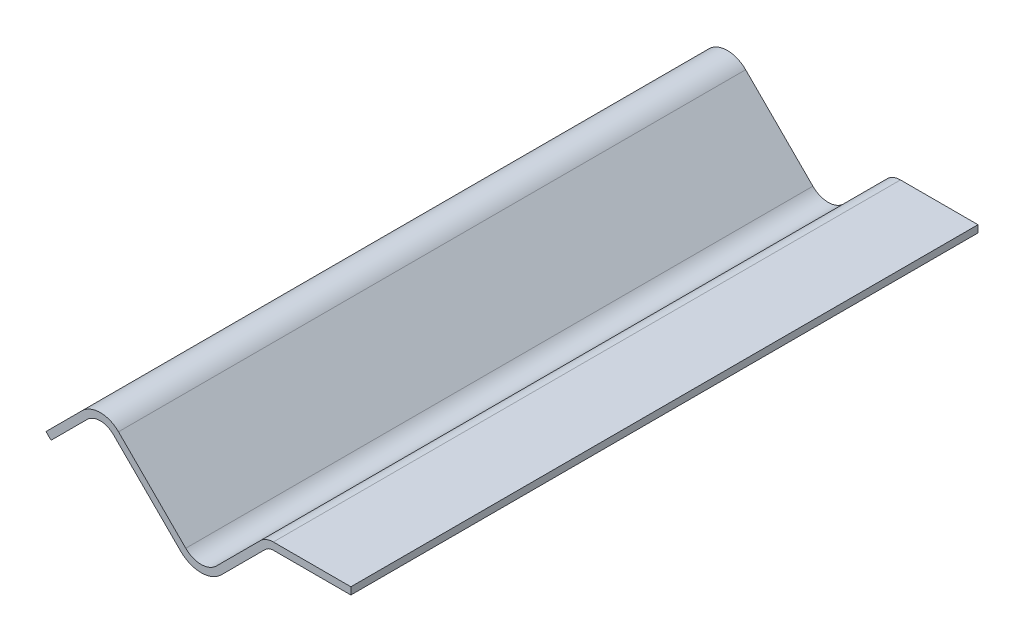
ISO-10303-21;
HEADER;
FILE_DESCRIPTION(('STEP AP214'),'2;1');
FILE_NAME('part.step','',(''),(''),'','','');
FILE_SCHEMA(('AUTOMOTIVE_DESIGN { 1 0 10303 214 1 1 1 1 }'));
ENDSEC;
DATA;
#1=APPLICATION_CONTEXT('core data for automotive mechanical design processes');
#2=APPLICATION_PROTOCOL_DEFINITION('international standard','automotive_design',2000,#1);
#3=PRODUCT_CONTEXT('',#1,'mechanical');
#4=PRODUCT('Part','Part','',(#3));
#5=PRODUCT_RELATED_PRODUCT_CATEGORY('part','',(#4));
#6=PRODUCT_DEFINITION_FORMATION('','',#4);
#7=PRODUCT_DEFINITION_CONTEXT('part definition',#1,'design');
#8=PRODUCT_DEFINITION('design','',#6,#7);
#9=PRODUCT_DEFINITION_SHAPE('','',#8);
#10=(LENGTH_UNIT() NAMED_UNIT(*) SI_UNIT(.MILLI.,.METRE.));
#11=(NAMED_UNIT(*) PLANE_ANGLE_UNIT() SI_UNIT($,.RADIAN.));
#12=(NAMED_UNIT(*) SI_UNIT($,.STERADIAN.) SOLID_ANGLE_UNIT());
#13=UNCERTAINTY_MEASURE_WITH_UNIT(LENGTH_MEASURE(1.E-05),#10,'distance_accuracy_value','');
#14=(GEOMETRIC_REPRESENTATION_CONTEXT(3) GLOBAL_UNCERTAINTY_ASSIGNED_CONTEXT((#13)) GLOBAL_UNIT_ASSIGNED_CONTEXT((#10,
#11,#12)) REPRESENTATION_CONTEXT('',''));
#15=CARTESIAN_POINT('',(0.,0.,0.));
#16=DIRECTION('',(0.,0.,1.));
#17=DIRECTION('',(1.,0.,0.));
#18=AXIS2_PLACEMENT_3D('',#15,#16,#17);
#19=CARTESIAN_POINT('',(2.0521699932434,-2.0521699932434,127.));
#20=DIRECTION('',(0.707106781186547,0.707106781186548,0.));
#21=DIRECTION('',(-0.707106781186548,0.707106781186547,0.));
#22=AXIS2_PLACEMENT_3D('',#19,#20,#21);
#23=PLANE('',#22);
#24=DIRECTION('',(0.707106781186548,-0.707106781186547,0.));
#25=VECTOR('',#24,1.);
#26=CARTESIAN_POINT('',(2.0521699932434,-2.0521699932434,-127.));
#27=LINE('',#26,#25);
#28=CARTESIAN_POINT('',(0.,0.,-127.));
#29=VERTEX_POINT('',#28);
#30=CARTESIAN_POINT('',(2.0521699932434,-2.0521699932434,-127.));
#31=VERTEX_POINT('',#30);
#32=EDGE_CURVE('E188',#29,#31,#27,.T.);
#33=ORIENTED_EDGE('',*,*,#32,.T.);
#34=DIRECTION('',(0.,0.,-1.));
#35=VECTOR('',#34,1.);
#36=CARTESIAN_POINT('',(2.0521699932434,-2.0521699932434,127.));
#37=LINE('',#36,#35);
#38=CARTESIAN_POINT('',(2.0521699932434,-2.0521699932434,127.));
#39=VERTEX_POINT('',#38);
#40=EDGE_CURVE('E11',#39,#31,#37,.T.);
#41=ORIENTED_EDGE('',*,*,#40,.F.);
#42=DIRECTION('',(0.707106781186548,-0.707106781186547,0.));
#43=VECTOR('',#42,1.);
#44=CARTESIAN_POINT('',(2.0521699932434,-2.0521699932434,127.));
#45=LINE('',#44,#43);
#46=CARTESIAN_POINT('',(0.,0.,127.));
#47=VERTEX_POINT('',#46);
#48=EDGE_CURVE('E234',#47,#39,#45,.T.);
#49=ORIENTED_EDGE('',*,*,#48,.F.);
#50=DIRECTION('',(0.,0.,-1.));
#51=VECTOR('',#50,1.);
#52=CARTESIAN_POINT('',(0.,0.,127.));
#53=LINE('',#52,#51);
#54=EDGE_CURVE('E184',#47,#29,#53,.T.);
#55=ORIENTED_EDGE('',*,*,#54,.T.);
#56=EDGE_LOOP('',(#33,#41,#49,#55));
#57=FACE_BOUND('',#56,.T.);
#58=ADVANCED_FACE('F39',(#57),#23,.F.);
#59=CARTESIAN_POINT('',(16.6399408158057,12.5356008293189,127.));
#60=DIRECTION('',(-0.707106781186547,0.707106781186548,0.));
#61=DIRECTION('',(-0.707106781186548,-0.707106781186547,0.));
#62=AXIS2_PLACEMENT_3D('',#59,#60,#61);
#63=PLANE('',#62);
#64=DIRECTION('',(0.707106781186548,0.707106781186547,0.));
#65=VECTOR('',#64,1.);
#66=CARTESIAN_POINT('',(16.6399408158057,12.5356008293189,-127.));
#67=LINE('',#66,#65);
#68=CARTESIAN_POINT('',(16.6399408158057,12.5356008293189,-127.));
#69=VERTEX_POINT('',#68);
#70=EDGE_CURVE('E192',#31,#69,#67,.T.);
#71=ORIENTED_EDGE('',*,*,#70,.T.);
#72=DIRECTION('',(0.,0.,-1.));
#73=VECTOR('',#72,1.);
#74=CARTESIAN_POINT('',(16.6399408158057,12.5356008293189,127.));
#75=LINE('',#74,#73);
#76=CARTESIAN_POINT('',(16.6399408158057,12.5356008293189,127.));
#77=VERTEX_POINT('',#76);
#78=EDGE_CURVE('E48',#77,#69,#75,.T.);
#79=ORIENTED_EDGE('',*,*,#78,.F.);
#80=DIRECTION('',(0.707106781186548,0.707106781186547,0.));
#81=VECTOR('',#80,1.);
#82=CARTESIAN_POINT('',(16.6399408158057,12.5356008293189,127.));
#83=LINE('',#82,#81);
#84=EDGE_CURVE('E123',#39,#77,#83,.T.);
#85=ORIENTED_EDGE('',*,*,#84,.F.);
#86=ORIENTED_EDGE('',*,*,#40,.T.);
#87=EDGE_LOOP('',(#71,#79,#85,#86));
#88=FACE_BOUND('',#87,.T.);
#89=ADVANCED_FACE('F356',(#88),#63,.F.);
#90=CARTESIAN_POINT('',(21.9791222168929,7.19641942823163,127.));
#91=DIRECTION('',(0.,0.,-1.));
#92=DIRECTION('',(-1.,0.,0.));
#93=AXIS2_PLACEMENT_3D('',#90,#91,#92);
#94=CYLINDRICAL_SURFACE('',#93,7.55074274938774);
#95=CARTESIAN_POINT('',(21.9791222168929,7.19641942823163,-127.));
#96=DIRECTION('',(0.,0.,-1.));
#97=DIRECTION('',(1.,0.,0.));
#98=AXIS2_PLACEMENT_3D('',#95,#96,#97);
#99=CIRCLE('',#98,7.55074274938774);
#100=CARTESIAN_POINT('',(27.3183036179801,12.5356008293189,-127.));
#101=VERTEX_POINT('',#100);
#102=EDGE_CURVE('E195',#69,#101,#99,.T.);
#103=ORIENTED_EDGE('',*,*,#102,.T.);
#104=DIRECTION('',(0.,0.,-1.));
#105=VECTOR('',#104,1.);
#106=CARTESIAN_POINT('',(27.3183036179801,12.5356008293189,127.));
#107=LINE('',#106,#105);
#108=CARTESIAN_POINT('',(27.3183036179801,12.5356008293189,127.));
#109=VERTEX_POINT('',#108);
#110=EDGE_CURVE('E277',#109,#101,#107,.T.);
#111=ORIENTED_EDGE('',*,*,#110,.F.);
#112=CARTESIAN_POINT('',(21.9791222168929,7.19641942823163,127.));
#113=DIRECTION('',(0.,0.,-1.));
#114=DIRECTION('',(1.,0.,0.));
#115=AXIS2_PLACEMENT_3D('',#112,#113,#114);
#116=CIRCLE('',#115,7.55074274938774);
#117=EDGE_CURVE('E287',#77,#109,#116,.T.);
#118=ORIENTED_EDGE('',*,*,#117,.F.);
#119=ORIENTED_EDGE('',*,*,#78,.T.);
#120=EDGE_LOOP('',(#103,#111,#118,#119));
#121=FACE_BOUND('',#120,.T.);
#122=ADVANCED_FACE('F285',(#121),#94,.F.);
#123=CARTESIAN_POINT('',(54.5533431349518,-14.6994386876528,127.));
#124=DIRECTION('',(0.707106781186547,0.707106781186548,0.));
#125=DIRECTION('',(-0.707106781186548,0.707106781186547,0.));
#126=AXIS2_PLACEMENT_3D('',#123,#124,#125);
#127=PLANE('',#126);
#128=DIRECTION('',(0.707106781186548,-0.707106781186547,0.));
#129=VECTOR('',#128,1.);
#130=CARTESIAN_POINT('',(54.5533431349518,-14.6994386876528,-127.));
#131=LINE('',#130,#129);
#132=CARTESIAN_POINT('',(54.5533431349518,-14.6994386876528,-127.));
#133=VERTEX_POINT('',#132);
#134=EDGE_CURVE('E198',#101,#133,#131,.T.);
#135=ORIENTED_EDGE('',*,*,#134,.T.);
#136=DIRECTION('',(0.,0.,-1.));
#137=VECTOR('',#136,1.);
#138=CARTESIAN_POINT('',(54.5533431349518,-14.6994386876528,127.));
#139=LINE('',#138,#137);
#140=CARTESIAN_POINT('',(54.5533431349518,-14.6994386876528,127.));
#141=VERTEX_POINT('',#140);
#142=EDGE_CURVE('E273',#141,#133,#139,.T.);
#143=ORIENTED_EDGE('',*,*,#142,.F.);
#144=DIRECTION('',(0.707106781186548,-0.707106781186547,0.));
#145=VECTOR('',#144,1.);
#146=CARTESIAN_POINT('',(54.5533431349518,-14.6994386876528,127.));
#147=LINE('',#146,#145);
#148=EDGE_CURVE('E306',#109,#141,#147,.T.);
#149=ORIENTED_EDGE('',*,*,#148,.F.);
#150=ORIENTED_EDGE('',*,*,#110,.T.);
#151=EDGE_LOOP('',(#135,#143,#149,#150));
#152=FACE_BOUND('',#151,.T.);
#153=ADVANCED_FACE('F296',(#152),#127,.F.);
#154=CARTESIAN_POINT('',(62.8183402356592,-6.43444158694546,127.));
#155=DIRECTION('',(0.,0.,-1.));
#156=DIRECTION('',(-1.,0.,0.));
#157=AXIS2_PLACEMENT_3D('',#154,#155,#156);
#158=CYLINDRICAL_SURFACE('',#157,11.6884709927947);
#159=CARTESIAN_POINT('',(62.8183402356592,-6.43444158694546,-127.));
#160=DIRECTION('',(0.,0.,1.));
#161=DIRECTION('',(-1.,0.,0.));
#162=AXIS2_PLACEMENT_3D('',#159,#160,#161);
#163=CIRCLE('',#162,11.6884709927947);
#164=CARTESIAN_POINT('',(71.0833373363666,-14.6994386876528,-127.));
#165=VERTEX_POINT('',#164);
#166=EDGE_CURVE('E201',#133,#165,#163,.T.);
#167=ORIENTED_EDGE('',*,*,#166,.T.);
#168=DIRECTION('',(0.,0.,-1.));
#169=VECTOR('',#168,1.);
#170=CARTESIAN_POINT('',(71.0833373363666,-14.6994386876528,127.));
#171=LINE('',#170,#169);
#172=CARTESIAN_POINT('',(71.0833373363666,-14.6994386876528,127.));
#173=VERTEX_POINT('',#172);
#174=EDGE_CURVE('E269',#173,#165,#171,.T.);
#175=ORIENTED_EDGE('',*,*,#174,.F.);
#176=CARTESIAN_POINT('',(62.8183402356592,-6.43444158694546,127.));
#177=DIRECTION('',(0.,0.,1.));
#178=DIRECTION('',(-1.,0.,0.));
#179=AXIS2_PLACEMENT_3D('',#176,#177,#178);
#180=CIRCLE('',#179,11.6884709927947);
#181=EDGE_CURVE('E302',#141,#173,#180,.T.);
#182=ORIENTED_EDGE('',*,*,#181,.F.);
#183=ORIENTED_EDGE('',*,*,#142,.T.);
#184=EDGE_LOOP('',(#167,#175,#182,#183));
#185=FACE_BOUND('',#184,.T.);
#186=ADVANCED_FACE('F300',(#185),#158,.T.);
#187=CARTESIAN_POINT('',(88.8144036169779,3.03162759295852,127.));
#188=DIRECTION('',(-0.707106781186547,0.707106781186548,0.));
#189=DIRECTION('',(-0.707106781186548,-0.707106781186547,0.));
#190=AXIS2_PLACEMENT_3D('',#187,#188,#189);
#191=PLANE('',#190);
#192=DIRECTION('',(0.707106781186548,0.707106781186547,0.));
#193=VECTOR('',#192,1.);
#194=CARTESIAN_POINT('',(88.8144036169779,3.03162759295852,-127.));
#195=LINE('',#194,#193);
#196=CARTESIAN_POINT('',(88.8144036169779,3.03162759295852,-127.));
#197=VERTEX_POINT('',#196);
#198=EDGE_CURVE('E204',#165,#197,#195,.T.);
#199=ORIENTED_EDGE('',*,*,#198,.T.);
#200=DIRECTION('',(0.,0.,-1.));
#201=VECTOR('',#200,1.);
#202=CARTESIAN_POINT('',(88.8144036169779,3.03162759295852,127.));
#203=LINE('',#202,#201);
#204=CARTESIAN_POINT('',(88.8144036169779,3.03162759295852,127.));
#205=VERTEX_POINT('',#204);
#206=EDGE_CURVE('E265',#205,#197,#203,.T.);
#207=ORIENTED_EDGE('',*,*,#206,.F.);
#208=DIRECTION('',(0.707106781186548,0.707106781186547,0.));
#209=VECTOR('',#208,1.);
#210=CARTESIAN_POINT('',(88.8144036169779,3.03162759295852,127.));
#211=LINE('',#210,#209);
#212=EDGE_CURVE('E305',#173,#205,#211,.T.);
#213=ORIENTED_EDGE('',*,*,#212,.F.);
#214=ORIENTED_EDGE('',*,*,#174,.T.);
#215=EDGE_LOOP('',(#199,#207,#213,#214));
#216=FACE_BOUND('',#215,.T.);
#217=ADVANCED_FACE('F369',(#216),#191,.F.);
#218=CARTESIAN_POINT('',(92.0805276098803,-0.234496399943819,127.));
#219=DIRECTION('',(0.,0.,-1.));
#220=DIRECTION('',(-1.,0.,0.));
#221=AXIS2_PLACEMENT_3D('',#218,#219,#220);
#222=CYLINDRICAL_SURFACE('',#221,4.61899684715465);
#223=CARTESIAN_POINT('',(92.0805276098803,-0.234496399943819,-127.));
#224=DIRECTION('',(0.,0.,-1.));
#225=DIRECTION('',(1.,0.,0.));
#226=AXIS2_PLACEMENT_3D('',#223,#224,#225);
#227=CIRCLE('',#226,4.61899684715465);
#228=CARTESIAN_POINT('',(92.0805276098803,4.38450044721083,-127.));
#229=VERTEX_POINT('',#228);
#230=EDGE_CURVE('E207',#197,#229,#227,.T.);
#231=ORIENTED_EDGE('',*,*,#230,.T.);
#232=DIRECTION('',(0.,0.,-1.));
#233=VECTOR('',#232,1.);
#234=CARTESIAN_POINT('',(92.0805276098803,4.38450044721083,127.));
#235=LINE('',#234,#233);
#236=CARTESIAN_POINT('',(92.0805276098803,4.38450044721083,127.));
#237=VERTEX_POINT('',#236);
#238=EDGE_CURVE('E261',#237,#229,#235,.T.);
#239=ORIENTED_EDGE('',*,*,#238,.F.);
#240=CARTESIAN_POINT('',(92.0805276098803,-0.234496399943819,127.));
#241=DIRECTION('',(0.,0.,-1.));
#242=DIRECTION('',(1.,0.,0.));
#243=AXIS2_PLACEMENT_3D('',#240,#241,#242);
#244=CIRCLE('',#243,4.61899684715465);
#245=EDGE_CURVE('E310',#205,#237,#244,.T.);
#246=ORIENTED_EDGE('',*,*,#245,.F.);
#247=ORIENTED_EDGE('',*,*,#206,.T.);
#248=EDGE_LOOP('',(#231,#239,#246,#247));
#249=FACE_BOUND('',#248,.T.);
#250=ADVANCED_FACE('F372',(#249),#222,.F.);
#251=CARTESIAN_POINT('',(123.484493194483,4.38450044721083,127.));
#252=DIRECTION('',(0.,1.,0.));
#253=DIRECTION('',(0.,0.,1.));
#254=AXIS2_PLACEMENT_3D('',#251,#252,#253);
#255=PLANE('',#254);
#256=DIRECTION('',(1.,0.,0.));
#257=VECTOR('',#256,1.);
#258=CARTESIAN_POINT('',(123.484493194483,4.38450044721083,-127.));
#259=LINE('',#258,#257);
#260=CARTESIAN_POINT('',(123.484493194483,4.38450044721083,-127.));
#261=VERTEX_POINT('',#260);
#262=EDGE_CURVE('E210',#229,#261,#259,.T.);
#263=ORIENTED_EDGE('',*,*,#262,.T.);
#264=DIRECTION('',(0.,0.,-1.));
#265=VECTOR('',#264,1.);
#266=CARTESIAN_POINT('',(123.484493194483,4.38450044721083,127.));
#267=LINE('',#266,#265);
#268=CARTESIAN_POINT('',(123.484493194483,4.38450044721083,127.));
#269=VERTEX_POINT('',#268);
#270=EDGE_CURVE('E257',#269,#261,#267,.T.);
#271=ORIENTED_EDGE('',*,*,#270,.F.);
#272=DIRECTION('',(1.,0.,0.));
#273=VECTOR('',#272,1.);
#274=CARTESIAN_POINT('',(123.484493194483,4.38450044721083,127.));
#275=LINE('',#274,#273);
#276=EDGE_CURVE('E317',#237,#269,#275,.T.);
#277=ORIENTED_EDGE('',*,*,#276,.F.);
#278=ORIENTED_EDGE('',*,*,#238,.T.);
#279=EDGE_LOOP('',(#263,#271,#277,#278));
#280=FACE_BOUND('',#279,.T.);
#281=ADVANCED_FACE('F376',(#280),#255,.F.);
#282=CARTESIAN_POINT('',(123.484493194483,7.28670708395075,127.));
#283=DIRECTION('',(-1.,0.,0.));
#284=DIRECTION('',(0.,0.,1.));
#285=AXIS2_PLACEMENT_3D('',#282,#283,#284);
#286=PLANE('',#285);
#287=DIRECTION('',(0.,1.,0.));
#288=VECTOR('',#287,1.);
#289=CARTESIAN_POINT('',(123.484493194483,7.28670708395075,-127.));
#290=LINE('',#289,#288);
#291=CARTESIAN_POINT('',(123.484493194483,7.28670708395075,-127.));
#292=VERTEX_POINT('',#291);
#293=EDGE_CURVE('E213',#261,#292,#290,.T.);
#294=ORIENTED_EDGE('',*,*,#293,.T.);
#295=DIRECTION('',(0.,0.,-1.));
#296=VECTOR('',#295,1.);
#297=CARTESIAN_POINT('',(123.484493194483,7.28670708395075,127.));
#298=LINE('',#297,#296);
#299=CARTESIAN_POINT('',(123.484493194483,7.28670708395075,127.));
#300=VERTEX_POINT('',#299);
#301=EDGE_CURVE('E253',#300,#292,#298,.T.);
#302=ORIENTED_EDGE('',*,*,#301,.F.);
#303=DIRECTION('',(0.,1.,0.));
#304=VECTOR('',#303,1.);
#305=CARTESIAN_POINT('',(123.484493194483,7.28670708395075,127.));
#306=LINE('',#305,#304);
#307=EDGE_CURVE('E320',#269,#300,#306,.T.);
#308=ORIENTED_EDGE('',*,*,#307,.F.);
#309=ORIENTED_EDGE('',*,*,#270,.T.);
#310=EDGE_LOOP('',(#294,#302,#308,#309));
#311=FACE_BOUND('',#310,.T.);
#312=ADVANCED_FACE('F380',(#311),#286,.F.);
#313=CARTESIAN_POINT('',(92.0805276098803,7.28670708395075,127.));
#314=DIRECTION('',(0.,-1.,0.));
#315=DIRECTION('',(0.,0.,-1.));
#316=AXIS2_PLACEMENT_3D('',#313,#314,#315);
#317=PLANE('',#316);
#318=DIRECTION('',(-1.,0.,0.));
#319=VECTOR('',#318,1.);
#320=CARTESIAN_POINT('',(92.0805276098803,7.28670708395075,-127.));
#321=LINE('',#320,#319);
#322=CARTESIAN_POINT('',(92.0805276098803,7.28670708395074,-127.));
#323=VERTEX_POINT('',#322);
#324=EDGE_CURVE('E216',#292,#323,#321,.T.);
#325=ORIENTED_EDGE('',*,*,#324,.T.);
#326=DIRECTION('',(0.,0.,-1.));
#327=VECTOR('',#326,1.);
#328=CARTESIAN_POINT('',(92.0805276098803,7.28670708395074,127.));
#329=LINE('',#328,#327);
#330=CARTESIAN_POINT('',(92.0805276098803,7.28670708395074,127.));
#331=VERTEX_POINT('',#330);
#332=EDGE_CURVE('E249',#331,#323,#329,.T.);
#333=ORIENTED_EDGE('',*,*,#332,.F.);
#334=DIRECTION('',(-1.,0.,0.));
#335=VECTOR('',#334,1.);
#336=CARTESIAN_POINT('',(92.0805276098803,7.28670708395075,127.));
#337=LINE('',#336,#335);
#338=EDGE_CURVE('E323',#300,#331,#337,.T.);
#339=ORIENTED_EDGE('',*,*,#338,.F.);
#340=ORIENTED_EDGE('',*,*,#301,.T.);
#341=EDGE_LOOP('',(#325,#333,#339,#340));
#342=FACE_BOUND('',#341,.T.);
#343=ADVANCED_FACE('F384',(#342),#317,.F.);
#344=CARTESIAN_POINT('',(92.0805276098803,-0.234496399943819,127.));
#345=DIRECTION('',(0.,0.,-1.));
#346=DIRECTION('',(-1.,0.,0.));
#347=AXIS2_PLACEMENT_3D('',#344,#345,#346);
#348=CYLINDRICAL_SURFACE('',#347,7.52120348389456);
#349=CARTESIAN_POINT('',(92.0805276098803,-0.234496399943819,-127.));
#350=DIRECTION('',(0.,0.,1.));
#351=DIRECTION('',(-1.,0.,0.));
#352=AXIS2_PLACEMENT_3D('',#349,#350,#351);
#353=CIRCLE('',#352,7.52120348389456);
#354=CARTESIAN_POINT('',(86.7622336237346,5.08379758620191,-127.));
#355=VERTEX_POINT('',#354);
#356=EDGE_CURVE('E219',#323,#355,#353,.T.);
#357=ORIENTED_EDGE('',*,*,#356,.T.);
#358=DIRECTION('',(0.,0.,-1.));
#359=VECTOR('',#358,1.);
#360=CARTESIAN_POINT('',(86.7622336237346,5.08379758620191,127.));
#361=LINE('',#360,#359);
#362=CARTESIAN_POINT('',(86.7622336237346,5.08379758620191,127.));
#363=VERTEX_POINT('',#362);
#364=EDGE_CURVE('E245',#363,#355,#361,.T.);
#365=ORIENTED_EDGE('',*,*,#364,.F.);
#366=CARTESIAN_POINT('',(92.0805276098803,-0.234496399943819,127.));
#367=DIRECTION('',(0.,0.,1.));
#368=DIRECTION('',(-1.,0.,0.));
#369=AXIS2_PLACEMENT_3D('',#366,#367,#368);
#370=CIRCLE('',#369,7.52120348389456);
#371=EDGE_CURVE('E326',#331,#363,#370,.T.);
#372=ORIENTED_EDGE('',*,*,#371,.F.);
#373=ORIENTED_EDGE('',*,*,#332,.T.);
#374=EDGE_LOOP('',(#357,#365,#372,#373));
#375=FACE_BOUND('',#374,.T.);
#376=ADVANCED_FACE('F388',(#375),#348,.T.);
#377=CARTESIAN_POINT('',(69.0311673431232,-12.6472686944094,127.));
#378=DIRECTION('',(0.707106781186547,-0.707106781186548,0.));
#379=DIRECTION('',(0.707106781186548,0.707106781186547,0.));
#380=AXIS2_PLACEMENT_3D('',#377,#378,#379);
#381=PLANE('',#380);
#382=DIRECTION('',(-0.707106781186548,-0.707106781186547,0.));
#383=VECTOR('',#382,1.);
#384=CARTESIAN_POINT('',(69.0311673431232,-12.6472686944094,-127.));
#385=LINE('',#384,#383);
#386=CARTESIAN_POINT('',(69.0311673431232,-12.6472686944094,-127.));
#387=VERTEX_POINT('',#386);
#388=EDGE_CURVE('E222',#355,#387,#385,.T.);
#389=ORIENTED_EDGE('',*,*,#388,.T.);
#390=DIRECTION('',(0.,0.,-1.));
#391=VECTOR('',#390,1.);
#392=CARTESIAN_POINT('',(69.0311673431232,-12.6472686944094,127.));
#393=LINE('',#392,#391);
#394=CARTESIAN_POINT('',(69.0311673431232,-12.6472686944094,127.));
#395=VERTEX_POINT('',#394);
#396=EDGE_CURVE('E241',#395,#387,#393,.T.);
#397=ORIENTED_EDGE('',*,*,#396,.F.);
#398=DIRECTION('',(-0.707106781186548,-0.707106781186547,0.));
#399=VECTOR('',#398,1.);
#400=CARTESIAN_POINT('',(69.0311673431232,-12.6472686944094,127.));
#401=LINE('',#400,#399);
#402=EDGE_CURVE('E329',#363,#395,#401,.T.);
#403=ORIENTED_EDGE('',*,*,#402,.F.);
#404=ORIENTED_EDGE('',*,*,#364,.T.);
#405=EDGE_LOOP('',(#389,#397,#403,#404));
#406=FACE_BOUND('',#405,.T.);
#407=ADVANCED_FACE('F337',(#406),#381,.F.);
#408=CARTESIAN_POINT('',(62.8183402356592,-6.43444158694546,127.));
#409=DIRECTION('',(0.,0.,-1.));
#410=DIRECTION('',(-1.,0.,0.));
#411=AXIS2_PLACEMENT_3D('',#408,#409,#410);
#412=CYLINDRICAL_SURFACE('',#411,8.78626435605477);
#413=CARTESIAN_POINT('',(62.8183402356592,-6.43444158694546,-127.));
#414=DIRECTION('',(0.,0.,-1.));
#415=DIRECTION('',(1.,0.,0.));
#416=AXIS2_PLACEMENT_3D('',#413,#414,#415);
#417=CIRCLE('',#416,8.78626435605477);
#418=CARTESIAN_POINT('',(56.6055131281952,-12.6472686944094,-127.));
#419=VERTEX_POINT('',#418);
#420=EDGE_CURVE('E225',#387,#419,#417,.T.);
#421=ORIENTED_EDGE('',*,*,#420,.T.);
#422=DIRECTION('',(0.,0.,-1.));
#423=VECTOR('',#422,1.);
#424=CARTESIAN_POINT('',(56.6055131281952,-12.6472686944094,127.));
#425=LINE('',#424,#423);
#426=CARTESIAN_POINT('',(56.6055131281952,-12.6472686944094,127.));
#427=VERTEX_POINT('',#426);
#428=EDGE_CURVE('E177',#427,#419,#425,.T.);
#429=ORIENTED_EDGE('',*,*,#428,.F.);
#430=CARTESIAN_POINT('',(62.8183402356592,-6.43444158694546,127.));
#431=DIRECTION('',(0.,0.,-1.));
#432=DIRECTION('',(1.,0.,0.));
#433=AXIS2_PLACEMENT_3D('',#430,#431,#432);
#434=CIRCLE('',#433,8.78626435605477);
#435=EDGE_CURVE('E166',#395,#427,#434,.T.);
#436=ORIENTED_EDGE('',*,*,#435,.F.);
#437=ORIENTED_EDGE('',*,*,#396,.T.);
#438=EDGE_LOOP('',(#421,#429,#436,#437));
#439=FACE_BOUND('',#438,.T.);
#440=ADVANCED_FACE('F341',(#439),#412,.F.);
#441=CARTESIAN_POINT('',(29.3704736112235,14.5877708225623,127.));
#442=DIRECTION('',(-0.707106781186548,-0.707106781186548,0.));
#443=DIRECTION('',(0.707106781186548,-0.707106781186548,0.));
#444=AXIS2_PLACEMENT_3D('',#441,#442,#443);
#445=PLANE('',#444);
#446=DIRECTION('',(-0.707106781186548,0.707106781186548,0.));
#447=VECTOR('',#446,1.);
#448=CARTESIAN_POINT('',(29.3704736112235,14.5877708225623,-127.));
#449=LINE('',#448,#447);
#450=CARTESIAN_POINT('',(29.3704736112235,14.5877708225623,-127.));
#451=VERTEX_POINT('',#450);
#452=EDGE_CURVE('E175',#419,#451,#449,.T.);
#453=ORIENTED_EDGE('',*,*,#452,.T.);
#454=DIRECTION('',(0.,0.,-1.));
#455=VECTOR('',#454,1.);
#456=CARTESIAN_POINT('',(29.3704736112235,14.5877708225623,127.));
#457=LINE('',#456,#455);
#458=CARTESIAN_POINT('',(29.3704736112235,14.5877708225623,127.));
#459=VERTEX_POINT('',#458);
#460=EDGE_CURVE('E172',#459,#451,#457,.T.);
#461=ORIENTED_EDGE('',*,*,#460,.F.);
#462=DIRECTION('',(-0.707106781186548,0.707106781186548,0.));
#463=VECTOR('',#462,1.);
#464=CARTESIAN_POINT('',(29.3704736112235,14.5877708225623,127.));
#465=LINE('',#464,#463);
#466=EDGE_CURVE('E160',#427,#459,#465,.T.);
#467=ORIENTED_EDGE('',*,*,#466,.F.);
#468=ORIENTED_EDGE('',*,*,#428,.T.);
#469=EDGE_LOOP('',(#453,#461,#467,#468));
#470=FACE_BOUND('',#469,.T.);
#471=ADVANCED_FACE('F173',(#470),#445,.F.);
#472=CARTESIAN_POINT('',(21.9791222168929,7.19641942823163,127.));
#473=DIRECTION('',(0.,0.,-1.));
#474=DIRECTION('',(-1.,0.,0.));
#475=AXIS2_PLACEMENT_3D('',#472,#473,#474);
#476=CYLINDRICAL_SURFACE('',#475,10.4529493861277);
#477=CARTESIAN_POINT('',(21.9791222168929,7.19641942823163,-127.));
#478=DIRECTION('',(0.,0.,1.));
#479=DIRECTION('',(-1.,0.,0.));
#480=AXIS2_PLACEMENT_3D('',#477,#478,#479);
#481=CIRCLE('',#480,10.4529493861277);
#482=CARTESIAN_POINT('',(14.5877708225623,14.5877708225623,-127.));
#483=VERTEX_POINT('',#482);
#484=EDGE_CURVE('E109',#451,#483,#481,.T.);
#485=ORIENTED_EDGE('',*,*,#484,.T.);
#486=DIRECTION('',(0.,0.,-1.));
#487=VECTOR('',#486,1.);
#488=CARTESIAN_POINT('',(14.5877708225623,14.5877708225623,127.));
#489=LINE('',#488,#487);
#490=CARTESIAN_POINT('',(14.5877708225623,14.5877708225623,127.));
#491=VERTEX_POINT('',#490);
#492=EDGE_CURVE('E178',#491,#483,#489,.T.);
#493=ORIENTED_EDGE('',*,*,#492,.F.);
#494=CARTESIAN_POINT('',(21.9791222168929,7.19641942823163,127.));
#495=DIRECTION('',(0.,0.,1.));
#496=DIRECTION('',(-1.,0.,0.));
#497=AXIS2_PLACEMENT_3D('',#494,#495,#496);
#498=CIRCLE('',#497,10.4529493861277);
#499=EDGE_CURVE('E164',#459,#491,#498,.T.);
#500=ORIENTED_EDGE('',*,*,#499,.F.);
#501=ORIENTED_EDGE('',*,*,#460,.T.);
#502=EDGE_LOOP('',(#485,#493,#500,#501));
#503=FACE_BOUND('',#502,.T.);
#504=ADVANCED_FACE('F180',(#503),#476,.T.);
#505=CARTESIAN_POINT('',(0.,0.,127.));
#506=DIRECTION('',(0.707106781186547,-0.707106781186548,0.));
#507=DIRECTION('',(0.707106781186548,0.707106781186547,0.));
#508=AXIS2_PLACEMENT_3D('',#505,#506,#507);
#509=PLANE('',#508);
#510=DIRECTION('',(-0.707106781186548,-0.707106781186547,0.));
#511=VECTOR('',#510,1.);
#512=CARTESIAN_POINT('',(0.,0.,-127.));
#513=LINE('',#512,#511);
#514=EDGE_CURVE('E115',#483,#29,#513,.T.);
#515=ORIENTED_EDGE('',*,*,#514,.T.);
#516=ORIENTED_EDGE('',*,*,#54,.F.);
#517=DIRECTION('',(-0.707106781186548,-0.707106781186547,0.));
#518=VECTOR('',#517,1.);
#519=CARTESIAN_POINT('',(0.,0.,127.));
#520=LINE('',#519,#518);
#521=EDGE_CURVE('E56',#491,#47,#520,.T.);
#522=ORIENTED_EDGE('',*,*,#521,.F.);
#523=ORIENTED_EDGE('',*,*,#492,.T.);
#524=EDGE_LOOP('',(#515,#516,#522,#523));
#525=FACE_BOUND('',#524,.T.);
#526=ADVANCED_FACE('F345',(#525),#509,.F.);
#527=CARTESIAN_POINT('',(21.9791222168929,7.19641942823163,127.));
#528=DIRECTION('',(0.,0.,-1.));
#529=DIRECTION('',(-1.,0.,0.));
#530=AXIS2_PLACEMENT_3D('',#527,#528,#529);
#531=PLANE('',#530);
#532=ORIENTED_EDGE('',*,*,#48,.T.);
#533=ORIENTED_EDGE('',*,*,#84,.T.);
#534=ORIENTED_EDGE('',*,*,#117,.T.);
#535=ORIENTED_EDGE('',*,*,#148,.T.);
#536=ORIENTED_EDGE('',*,*,#181,.T.);
#537=ORIENTED_EDGE('',*,*,#212,.T.);
#538=ORIENTED_EDGE('',*,*,#245,.T.);
#539=ORIENTED_EDGE('',*,*,#276,.T.);
#540=ORIENTED_EDGE('',*,*,#307,.T.);
#541=ORIENTED_EDGE('',*,*,#338,.T.);
#542=ORIENTED_EDGE('',*,*,#371,.T.);
#543=ORIENTED_EDGE('',*,*,#402,.T.);
#544=ORIENTED_EDGE('',*,*,#435,.T.);
#545=ORIENTED_EDGE('',*,*,#466,.T.);
#546=ORIENTED_EDGE('',*,*,#499,.T.);
#547=ORIENTED_EDGE('',*,*,#521,.T.);
#548=EDGE_LOOP('',(#532,#533,#534,#535,#536,#537,#538,#539,#540,#541,#542,#543,#544,#545,#546,#547));
#549=FACE_BOUND('',#548,.T.);
#550=ADVANCED_FACE('F162',(#549),#531,.F.);
#551=CARTESIAN_POINT('',(21.9791222168929,7.19641942823163,-127.));
#552=DIRECTION('',(0.,0.,-1.));
#553=DIRECTION('',(-1.,0.,0.));
#554=AXIS2_PLACEMENT_3D('',#551,#552,#553);
#555=PLANE('',#554);
#556=ORIENTED_EDGE('',*,*,#32,.F.);
#557=ORIENTED_EDGE('',*,*,#514,.F.);
#558=ORIENTED_EDGE('',*,*,#484,.F.);
#559=ORIENTED_EDGE('',*,*,#452,.F.);
#560=ORIENTED_EDGE('',*,*,#420,.F.);
#561=ORIENTED_EDGE('',*,*,#388,.F.);
#562=ORIENTED_EDGE('',*,*,#356,.F.);
#563=ORIENTED_EDGE('',*,*,#324,.F.);
#564=ORIENTED_EDGE('',*,*,#293,.F.);
#565=ORIENTED_EDGE('',*,*,#262,.F.);
#566=ORIENTED_EDGE('',*,*,#230,.F.);
#567=ORIENTED_EDGE('',*,*,#198,.F.);
#568=ORIENTED_EDGE('',*,*,#166,.F.);
#569=ORIENTED_EDGE('',*,*,#134,.F.);
#570=ORIENTED_EDGE('',*,*,#102,.F.);
#571=ORIENTED_EDGE('',*,*,#70,.F.);
#572=EDGE_LOOP('',(#556,#557,#558,#559,#560,#561,#562,#563,#564,#565,#566,#567,#568,#569,#570,#571));
#573=FACE_BOUND('',#572,.T.);
#574=ADVANCED_FACE('F291',(#573),#555,.T.);
#575=CLOSED_SHELL('',(#58,#89,#122,#153,#186,#217,#250,#281,#312,#343,#376,#407,#440,#471,#504,
#526,#550,#574));
#576=MANIFOLD_SOLID_BREP('B2',#575);
#577=ADVANCED_BREP_SHAPE_REPRESENTATION('',(#18,#576),#14);
#578=SHAPE_DEFINITION_REPRESENTATION(#9,#577);
ENDSEC;
END-ISO-10303-21;
